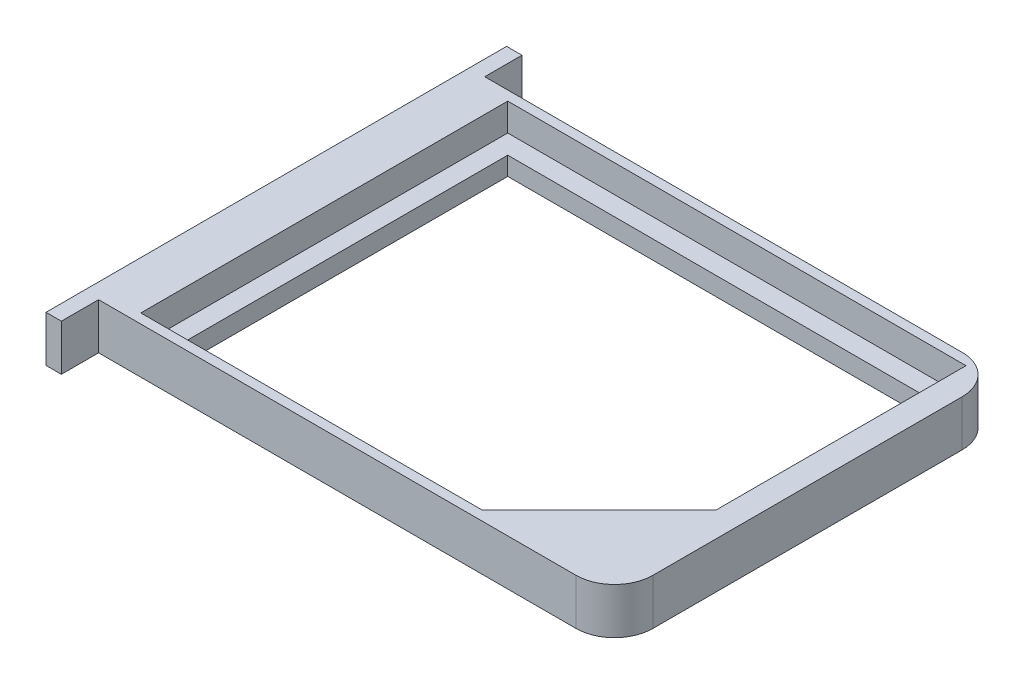
ISO-10303-21;
HEADER;
FILE_DESCRIPTION(('STEP AP214'),'2;1');
FILE_NAME('part.step','',(''),(''),'','','');
FILE_SCHEMA(('AUTOMOTIVE_DESIGN { 1 0 10303 214 1 1 1 1 }'));
ENDSEC;
DATA;
#1=APPLICATION_CONTEXT('core data for automotive mechanical design processes');
#2=APPLICATION_PROTOCOL_DEFINITION('international standard','automotive_design',2000,#1);
#3=PRODUCT_CONTEXT('',#1,'mechanical');
#4=PRODUCT('Part','Part','',(#3));
#5=PRODUCT_RELATED_PRODUCT_CATEGORY('part','',(#4));
#6=PRODUCT_DEFINITION_FORMATION('','',#4);
#7=PRODUCT_DEFINITION_CONTEXT('part definition',#1,'design');
#8=PRODUCT_DEFINITION('design','',#6,#7);
#9=PRODUCT_DEFINITION_SHAPE('','',#8);
#10=(LENGTH_UNIT() NAMED_UNIT(*) SI_UNIT(.MILLI.,.METRE.));
#11=(NAMED_UNIT(*) PLANE_ANGLE_UNIT() SI_UNIT($,.RADIAN.));
#12=(NAMED_UNIT(*) SI_UNIT($,.STERADIAN.) SOLID_ANGLE_UNIT());
#13=UNCERTAINTY_MEASURE_WITH_UNIT(LENGTH_MEASURE(1.E-05),#10,'distance_accuracy_value','');
#14=(GEOMETRIC_REPRESENTATION_CONTEXT(3) GLOBAL_UNCERTAINTY_ASSIGNED_CONTEXT((#13)) GLOBAL_UNIT_ASSIGNED_CONTEXT((#10,
#11,#12)) REPRESENTATION_CONTEXT('',''));
#15=CARTESIAN_POINT('',(0.,0.,0.));
#16=DIRECTION('',(0.,0.,1.));
#17=DIRECTION('',(1.,0.,0.));
#18=AXIS2_PLACEMENT_3D('',#15,#16,#17);
#19=CARTESIAN_POINT('',(16.2433,0.,-12.4587));
#20=DIRECTION('',(1.,0.,0.));
#21=DIRECTION('',(0.,0.,-1.));
#22=AXIS2_PLACEMENT_3D('',#19,#20,#21);
#23=PLANE('',#22);
#24=DIRECTION('',(0.,0.,-1.));
#25=VECTOR('',#24,1.);
#26=CARTESIAN_POINT('',(16.2433,0.6096,-4.19138494480313));
#27=LINE('',#26,#25);
#28=CARTESIAN_POINT('',(16.2433,0.6096,-4.19138494480313));
#29=VERTEX_POINT('',#28);
#30=CARTESIAN_POINT('',(16.2433,0.6096,-12.4587));
#31=VERTEX_POINT('',#30);
#32=EDGE_CURVE('E285',#29,#31,#27,.T.);
#33=ORIENTED_EDGE('',*,*,#32,.F.);
#34=DIRECTION('',(0.,-1.,0.));
#35=VECTOR('',#34,1.);
#36=CARTESIAN_POINT('',(16.2433,1.524,-4.19138494480313));
#37=LINE('',#36,#35);
#38=CARTESIAN_POINT('',(16.2433,1.524,-4.19138494480313));
#39=VERTEX_POINT('',#38);
#40=EDGE_CURVE('E293',#39,#29,#37,.T.);
#41=ORIENTED_EDGE('',*,*,#40,.F.);
#42=DIRECTION('',(0.,0.,-1.));
#43=VECTOR('',#42,1.);
#44=CARTESIAN_POINT('',(16.2433,1.524,-12.4587));
#45=LINE('',#44,#43);
#46=CARTESIAN_POINT('',(16.2433,1.524,-12.4587));
#47=VERTEX_POINT('',#46);
#48=EDGE_CURVE('E308',#39,#47,#45,.T.);
#49=ORIENTED_EDGE('',*,*,#48,.T.);
#50=DIRECTION('',(0.,1.,0.));
#51=VECTOR('',#50,1.);
#52=CARTESIAN_POINT('',(16.2433,0.,-12.4587));
#53=LINE('',#52,#51);
#54=EDGE_CURVE('E317',#31,#47,#53,.T.);
#55=ORIENTED_EDGE('',*,*,#54,.F.);
#56=EDGE_LOOP('',(#33,#41,#49,#55));
#57=FACE_BOUND('',#56,.T.);
#58=ADVANCED_FACE('F42',(#57),#23,.F.);
#59=CARTESIAN_POINT('',(1.07949999999999,0.,-12.4587));
#60=DIRECTION('',(-1.,0.,0.));
#61=DIRECTION('',(0.,0.,1.));
#62=AXIS2_PLACEMENT_3D('',#59,#60,#61);
#63=PLANE('',#62);
#64=DIRECTION('',(0.,0.,1.));
#65=VECTOR('',#64,1.);
#66=CARTESIAN_POINT('',(1.07949999999999,0.6096,-12.4587));
#67=LINE('',#66,#65);
#68=CARTESIAN_POINT('',(1.07949999999999,0.6096,-12.4587));
#69=VERTEX_POINT('',#68);
#70=CARTESIAN_POINT('',(1.0795,0.6096,-0.3175));
#71=VERTEX_POINT('',#70);
#72=EDGE_CURVE('E66',#69,#71,#67,.T.);
#73=ORIENTED_EDGE('',*,*,#72,.F.);
#74=DIRECTION('',(0.,1.,0.));
#75=VECTOR('',#74,1.);
#76=CARTESIAN_POINT('',(1.07949999999999,0.,-12.4587));
#77=LINE('',#76,#75);
#78=CARTESIAN_POINT('',(1.07949999999999,1.524,-12.4587));
#79=VERTEX_POINT('',#78);
#80=EDGE_CURVE('E312',#69,#79,#77,.T.);
#81=ORIENTED_EDGE('',*,*,#80,.T.);
#82=DIRECTION('',(0.,0.,1.));
#83=VECTOR('',#82,1.);
#84=CARTESIAN_POINT('',(1.07949999999999,1.524,-12.4587));
#85=LINE('',#84,#83);
#86=CARTESIAN_POINT('',(1.0795,1.524,-0.3175));
#87=VERTEX_POINT('',#86);
#88=EDGE_CURVE('E297',#79,#87,#85,.T.);
#89=ORIENTED_EDGE('',*,*,#88,.T.);
#90=DIRECTION('',(0.,1.,0.));
#91=VECTOR('',#90,1.);
#92=CARTESIAN_POINT('',(1.0795,0.,-0.3175));
#93=LINE('',#92,#91);
#94=EDGE_CURVE('E314',#71,#87,#93,.T.);
#95=ORIENTED_EDGE('',*,*,#94,.F.);
#96=EDGE_LOOP('',(#73,#81,#89,#95));
#97=FACE_BOUND('',#96,.T.);
#98=ADVANCED_FACE('F445',(#97),#63,.F.);
#99=CARTESIAN_POINT('',(1.07949999999999,0.,-12.4587));
#100=DIRECTION('',(0.,0.,-1.));
#101=DIRECTION('',(-1.,0.,0.));
#102=AXIS2_PLACEMENT_3D('',#99,#100,#101);
#103=PLANE('',#102);
#104=DIRECTION('',(-1.,0.,0.));
#105=VECTOR('',#104,1.);
#106=CARTESIAN_POINT('',(16.2433,0.6096,-12.4587));
#107=LINE('',#106,#105);
#108=EDGE_CURVE('E58',#31,#69,#107,.T.);
#109=ORIENTED_EDGE('',*,*,#108,.F.);
#110=ORIENTED_EDGE('',*,*,#54,.T.);
#111=DIRECTION('',(-1.,0.,0.));
#112=VECTOR('',#111,1.);
#113=CARTESIAN_POINT('',(1.07949999999999,1.524,-12.4587));
#114=LINE('',#113,#112);
#115=EDGE_CURVE('E309',#47,#79,#114,.T.);
#116=ORIENTED_EDGE('',*,*,#115,.T.);
#117=ORIENTED_EDGE('',*,*,#80,.F.);
#118=EDGE_LOOP('',(#109,#110,#116,#117));
#119=FACE_BOUND('',#118,.T.);
#120=ADVANCED_FACE('F447',(#119),#103,.F.);
#121=CARTESIAN_POINT('',(1.0795,0.,-0.3175));
#122=DIRECTION('',(0.,0.,1.));
#123=DIRECTION('',(1.,0.,0.));
#124=AXIS2_PLACEMENT_3D('',#121,#122,#123);
#125=PLANE('',#124);
#126=DIRECTION('',(1.,0.,0.));
#127=VECTOR('',#126,1.);
#128=CARTESIAN_POINT('',(1.0795,0.6096,-0.3175));
#129=LINE('',#128,#127);
#130=CARTESIAN_POINT('',(12.3694150551969,0.6096,-0.3175));
#131=VERTEX_POINT('',#130);
#132=EDGE_CURVE('E273',#71,#131,#129,.T.);
#133=ORIENTED_EDGE('',*,*,#132,.F.);
#134=ORIENTED_EDGE('',*,*,#94,.T.);
#135=DIRECTION('',(1.,0.,0.));
#136=VECTOR('',#135,1.);
#137=CARTESIAN_POINT('',(1.0795,1.524,-0.3175));
#138=LINE('',#137,#136);
#139=CARTESIAN_POINT('',(12.3694150551969,1.524,-0.3175));
#140=VERTEX_POINT('',#139);
#141=EDGE_CURVE('E305',#87,#140,#138,.T.);
#142=ORIENTED_EDGE('',*,*,#141,.T.);
#143=DIRECTION('',(0.,-1.,0.));
#144=VECTOR('',#143,1.);
#145=CARTESIAN_POINT('',(12.3694150551969,1.524,-0.3175));
#146=LINE('',#145,#144);
#147=EDGE_CURVE('E292',#140,#131,#146,.T.);
#148=ORIENTED_EDGE('',*,*,#147,.T.);
#149=EDGE_LOOP('',(#133,#134,#142,#148));
#150=FACE_BOUND('',#149,.T.);
#151=ADVANCED_FACE('F454',(#150),#125,.F.);
#152=CARTESIAN_POINT('',(12.3694150551969,1.524,-0.3175));
#153=DIRECTION('',(0.707106781186551,0.,0.707106781186543));
#154=DIRECTION('',(0.707106781186544,0.,-0.707106781186552));
#155=AXIS2_PLACEMENT_3D('',#152,#153,#154);
#156=PLANE('',#155);
#157=DIRECTION('',(0.707106781186544,0.,-0.707106781186551));
#158=VECTOR('',#157,1.);
#159=CARTESIAN_POINT('',(12.3694150551969,0.6096,-0.3175));
#160=LINE('',#159,#158);
#161=EDGE_CURVE('E279',#131,#29,#160,.T.);
#162=ORIENTED_EDGE('',*,*,#161,.F.);
#163=ORIENTED_EDGE('',*,*,#147,.F.);
#164=DIRECTION('',(-0.707106781186544,0.,0.707106781186551));
#165=VECTOR('',#164,1.);
#166=CARTESIAN_POINT('',(12.3694150551969,1.524,-0.3175));
#167=LINE('',#166,#165);
#168=EDGE_CURVE('E286',#39,#140,#167,.T.);
#169=ORIENTED_EDGE('',*,*,#168,.F.);
#170=ORIENTED_EDGE('',*,*,#40,.T.);
#171=EDGE_LOOP('',(#162,#163,#169,#170));
#172=FACE_BOUND('',#171,.T.);
#173=ADVANCED_FACE('F457',(#172),#156,.F.);
#174=CARTESIAN_POINT('',(0.,1.524,0.));
#175=DIRECTION('',(0.,0.,-1.));
#176=DIRECTION('',(-1.,0.,0.));
#177=AXIS2_PLACEMENT_3D('',#174,#175,#176);
#178=PLANE('',#177);
#179=DIRECTION('',(1.,0.,0.));
#180=VECTOR('',#179,1.);
#181=CARTESIAN_POINT('',(0.,0.,0.));
#182=LINE('',#181,#180);
#183=CARTESIAN_POINT('',(0.,0.,0.));
#184=VERTEX_POINT('',#183);
#185=CARTESIAN_POINT('',(15.7988,0.,0.));
#186=VERTEX_POINT('',#185);
#187=EDGE_CURVE('E318',#184,#186,#182,.T.);
#188=ORIENTED_EDGE('',*,*,#187,.T.);
#189=DIRECTION('',(0.,-1.,0.));
#190=VECTOR('',#189,1.);
#191=CARTESIAN_POINT('',(15.7988,1.524,0.));
#192=LINE('',#191,#190);
#193=CARTESIAN_POINT('',(15.7988,1.524,0.));
#194=VERTEX_POINT('',#193);
#195=EDGE_CURVE('E52',#194,#186,#192,.T.);
#196=ORIENTED_EDGE('',*,*,#195,.F.);
#197=DIRECTION('',(1.,0.,0.));
#198=VECTOR('',#197,1.);
#199=CARTESIAN_POINT('',(0.,1.524,0.));
#200=LINE('',#199,#198);
#201=CARTESIAN_POINT('',(0.,1.524,0.));
#202=VERTEX_POINT('',#201);
#203=EDGE_CURVE('E322',#202,#194,#200,.T.);
#204=ORIENTED_EDGE('',*,*,#203,.F.);
#205=DIRECTION('',(0.,-1.,0.));
#206=VECTOR('',#205,1.);
#207=CARTESIAN_POINT('',(0.,1.524,0.));
#208=LINE('',#207,#206);
#209=EDGE_CURVE('E11',#202,#184,#208,.T.);
#210=ORIENTED_EDGE('',*,*,#209,.T.);
#211=EDGE_LOOP('',(#188,#196,#204,#210));
#212=FACE_BOUND('',#211,.T.);
#213=ADVANCED_FACE('F46',(#212),#178,.F.);
#214=CARTESIAN_POINT('',(15.7988,1.524,-1.27));
#215=DIRECTION('',(0.,-1.,0.));
#216=DIRECTION('',(0.,0.,-1.));
#217=AXIS2_PLACEMENT_3D('',#214,#215,#216);
#218=CYLINDRICAL_SURFACE('',#217,1.27);
#219=CARTESIAN_POINT('',(15.7988,0.,-1.27));
#220=DIRECTION('',(0.,1.,0.));
#221=DIRECTION('',(0.,0.,1.));
#222=AXIS2_PLACEMENT_3D('',#219,#220,#221);
#223=CIRCLE('',#222,1.27);
#224=CARTESIAN_POINT('',(17.0688,0.,-1.27000000000001));
#225=VERTEX_POINT('',#224);
#226=EDGE_CURVE('E341',#186,#225,#223,.T.);
#227=ORIENTED_EDGE('',*,*,#226,.T.);
#228=DIRECTION('',(0.,-1.,0.));
#229=VECTOR('',#228,1.);
#230=CARTESIAN_POINT('',(17.0688,1.524,-1.27000000000001));
#231=LINE('',#230,#229);
#232=CARTESIAN_POINT('',(17.0688,1.524,-1.27000000000001));
#233=VERTEX_POINT('',#232);
#234=EDGE_CURVE('E364',#233,#225,#231,.T.);
#235=ORIENTED_EDGE('',*,*,#234,.F.);
#236=CARTESIAN_POINT('',(15.7988,1.524,-1.27));
#237=DIRECTION('',(0.,1.,0.));
#238=DIRECTION('',(0.,0.,1.));
#239=AXIS2_PLACEMENT_3D('',#236,#237,#238);
#240=CIRCLE('',#239,1.27);
#241=EDGE_CURVE('E330',#194,#233,#240,.T.);
#242=ORIENTED_EDGE('',*,*,#241,.F.);
#243=ORIENTED_EDGE('',*,*,#195,.T.);
#244=EDGE_LOOP('',(#227,#235,#242,#243));
#245=FACE_BOUND('',#244,.T.);
#246=ADVANCED_FACE('F372',(#245),#218,.T.);
#247=CARTESIAN_POINT('',(17.0688,1.524,-1.27000000000001));
#248=DIRECTION('',(-1.,0.,0.));
#249=DIRECTION('',(0.,0.,1.));
#250=AXIS2_PLACEMENT_3D('',#247,#248,#249);
#251=PLANE('',#250);
#252=DIRECTION('',(0.,0.,-1.));
#253=VECTOR('',#252,1.);
#254=CARTESIAN_POINT('',(17.0688,0.,-1.27000000000001));
#255=LINE('',#254,#253);
#256=CARTESIAN_POINT('',(17.0688,0.,-11.5062));
#257=VERTEX_POINT('',#256);
#258=EDGE_CURVE('E347',#225,#257,#255,.T.);
#259=ORIENTED_EDGE('',*,*,#258,.T.);
#260=DIRECTION('',(0.,-1.,0.));
#261=VECTOR('',#260,1.);
#262=CARTESIAN_POINT('',(17.0688,1.524,-11.5062));
#263=LINE('',#262,#261);
#264=CARTESIAN_POINT('',(17.0688,1.524,-11.5062));
#265=VERTEX_POINT('',#264);
#266=EDGE_CURVE('E363',#265,#257,#263,.T.);
#267=ORIENTED_EDGE('',*,*,#266,.F.);
#268=DIRECTION('',(0.,0.,-1.));
#269=VECTOR('',#268,1.);
#270=CARTESIAN_POINT('',(17.0688,1.524,-1.27000000000001));
#271=LINE('',#270,#269);
#272=EDGE_CURVE('E332',#233,#265,#271,.T.);
#273=ORIENTED_EDGE('',*,*,#272,.F.);
#274=ORIENTED_EDGE('',*,*,#234,.T.);
#275=EDGE_LOOP('',(#259,#267,#273,#274));
#276=FACE_BOUND('',#275,.T.);
#277=ADVANCED_FACE('F385',(#276),#251,.F.);
#278=CARTESIAN_POINT('',(15.7988,1.524,-11.5062));
#279=DIRECTION('',(0.,-1.,0.));
#280=DIRECTION('',(0.,0.,-1.));
#281=AXIS2_PLACEMENT_3D('',#278,#279,#280);
#282=CYLINDRICAL_SURFACE('',#281,1.27);
#283=CARTESIAN_POINT('',(15.7988,0.,-11.5062));
#284=DIRECTION('',(0.,1.,0.));
#285=DIRECTION('',(0.,0.,-1.));
#286=AXIS2_PLACEMENT_3D('',#283,#284,#285);
#287=CIRCLE('',#286,1.27);
#288=CARTESIAN_POINT('',(15.7988,0.,-12.7762));
#289=VERTEX_POINT('',#288);
#290=EDGE_CURVE('E349',#257,#289,#287,.T.);
#291=ORIENTED_EDGE('',*,*,#290,.T.);
#292=DIRECTION('',(0.,-1.,0.));
#293=VECTOR('',#292,1.);
#294=CARTESIAN_POINT('',(15.7988,1.524,-12.7762));
#295=LINE('',#294,#293);
#296=CARTESIAN_POINT('',(15.7988,1.524,-12.7762));
#297=VERTEX_POINT('',#296);
#298=EDGE_CURVE('E360',#297,#289,#295,.T.);
#299=ORIENTED_EDGE('',*,*,#298,.F.);
#300=CARTESIAN_POINT('',(15.7988,1.524,-11.5062));
#301=DIRECTION('',(0.,1.,0.));
#302=DIRECTION('',(0.,0.,-1.));
#303=AXIS2_PLACEMENT_3D('',#300,#301,#302);
#304=CIRCLE('',#303,1.27);
#305=EDGE_CURVE('E331',#265,#297,#304,.T.);
#306=ORIENTED_EDGE('',*,*,#305,.F.);
#307=ORIENTED_EDGE('',*,*,#266,.T.);
#308=EDGE_LOOP('',(#291,#299,#306,#307));
#309=FACE_BOUND('',#308,.T.);
#310=ADVANCED_FACE('F387',(#309),#282,.T.);
#311=CARTESIAN_POINT('',(0.,1.524,-12.7762));
#312=DIRECTION('',(0.,0.,1.));
#313=DIRECTION('',(1.,0.,0.));
#314=AXIS2_PLACEMENT_3D('',#311,#312,#313);
#315=PLANE('',#314);
#316=DIRECTION('',(-1.,0.,0.));
#317=VECTOR('',#316,1.);
#318=CARTESIAN_POINT('',(0.,0.,-12.7762));
#319=LINE('',#318,#317);
#320=CARTESIAN_POINT('',(0.,0.,-12.7762));
#321=VERTEX_POINT('',#320);
#322=EDGE_CURVE('E327',#289,#321,#319,.T.);
#323=ORIENTED_EDGE('',*,*,#322,.T.);
#324=DIRECTION('',(0.,-1.,0.));
#325=VECTOR('',#324,1.);
#326=CARTESIAN_POINT('',(0.,1.524,-12.7762));
#327=LINE('',#326,#325);
#328=CARTESIAN_POINT('',(0.,1.524,-12.7762));
#329=VERTEX_POINT('',#328);
#330=EDGE_CURVE('E339',#329,#321,#327,.T.);
#331=ORIENTED_EDGE('',*,*,#330,.F.);
#332=DIRECTION('',(-1.,0.,0.));
#333=VECTOR('',#332,1.);
#334=CARTESIAN_POINT('',(0.,1.524,-12.7762));
#335=LINE('',#334,#333);
#336=EDGE_CURVE('E340',#297,#329,#335,.T.);
#337=ORIENTED_EDGE('',*,*,#336,.F.);
#338=ORIENTED_EDGE('',*,*,#298,.T.);
#339=EDGE_LOOP('',(#323,#331,#337,#338));
#340=FACE_BOUND('',#339,.T.);
#341=ADVANCED_FACE('F427',(#340),#315,.F.);
#342=CARTESIAN_POINT('',(15.7988,1.524,-11.5062));
#343=DIRECTION('',(0.,-1.,0.));
#344=DIRECTION('',(0.,0.,-1.));
#345=AXIS2_PLACEMENT_3D('',#342,#343,#344);
#346=PLANE('',#345);
#347=ORIENTED_EDGE('',*,*,#141,.F.);
#348=ORIENTED_EDGE('',*,*,#88,.F.);
#349=ORIENTED_EDGE('',*,*,#115,.F.);
#350=ORIENTED_EDGE('',*,*,#48,.F.);
#351=ORIENTED_EDGE('',*,*,#168,.T.);
#352=EDGE_LOOP('',(#347,#348,#349,#350,#351));
#353=FACE_BOUND('',#352,.T.);
#354=ORIENTED_EDGE('',*,*,#336,.T.);
#355=DIRECTION('',(0.,0.,-1.));
#356=VECTOR('',#355,1.);
#357=CARTESIAN_POINT('',(0.,1.524,-14.0081));
#358=LINE('',#357,#356);
#359=CARTESIAN_POINT('',(0.,1.524,-14.0081));
#360=VERTEX_POINT('',#359);
#361=EDGE_CURVE('E415',#329,#360,#358,.T.);
#362=ORIENTED_EDGE('',*,*,#361,.T.);
#363=DIRECTION('',(1.,0.,0.));
#364=VECTOR('',#363,1.);
#365=CARTESIAN_POINT('',(-0.508000000000008,1.524,-14.0081));
#366=LINE('',#365,#364);
#367=CARTESIAN_POINT('',(-0.508000000000008,1.524,-14.0081));
#368=VERTEX_POINT('',#367);
#369=EDGE_CURVE('E412',#368,#360,#366,.T.);
#370=ORIENTED_EDGE('',*,*,#369,.F.);
#371=DIRECTION('',(0.,0.,-1.));
#372=VECTOR('',#371,1.);
#373=CARTESIAN_POINT('',(-0.508000000000008,1.524,-14.0081));
#374=LINE('',#373,#372);
#375=CARTESIAN_POINT('',(-0.507999999999999,1.524,1.2319));
#376=VERTEX_POINT('',#375);
#377=EDGE_CURVE('E205',#376,#368,#374,.T.);
#378=ORIENTED_EDGE('',*,*,#377,.F.);
#379=DIRECTION('',(1.,0.,0.));
#380=VECTOR('',#379,1.);
#381=CARTESIAN_POINT('',(-0.507999999999999,1.524,1.2319));
#382=LINE('',#381,#380);
#383=CARTESIAN_POINT('',(0.,1.524,1.2319));
#384=VERTEX_POINT('',#383);
#385=EDGE_CURVE('E219',#376,#384,#382,.T.);
#386=ORIENTED_EDGE('',*,*,#385,.T.);
#387=EDGE_CURVE('E210',#384,#202,#358,.T.);
#388=ORIENTED_EDGE('',*,*,#387,.T.);
#389=ORIENTED_EDGE('',*,*,#203,.T.);
#390=ORIENTED_EDGE('',*,*,#241,.T.);
#391=ORIENTED_EDGE('',*,*,#272,.T.);
#392=ORIENTED_EDGE('',*,*,#305,.T.);
#393=EDGE_LOOP('',(#354,#362,#370,#378,#386,#388,#389,#390,#391,#392));
#394=FACE_BOUND('',#393,.T.);
#395=ADVANCED_FACE('F388',(#353,#394),#346,.F.);
#396=CARTESIAN_POINT('',(15.7988,0.,-11.5062));
#397=DIRECTION('',(0.,-1.,0.));
#398=DIRECTION('',(0.,0.,-1.));
#399=AXIS2_PLACEMENT_3D('',#396,#397,#398);
#400=PLANE('',#399);
#401=ORIENTED_EDGE('',*,*,#187,.F.);
#402=DIRECTION('',(0.,0.,1.));
#403=VECTOR('',#402,1.);
#404=CARTESIAN_POINT('',(0.,0.,-14.0081));
#405=LINE('',#404,#403);
#406=CARTESIAN_POINT('',(0.,0.,1.2319));
#407=VERTEX_POINT('',#406);
#408=EDGE_CURVE('E397',#184,#407,#405,.T.);
#409=ORIENTED_EDGE('',*,*,#408,.T.);
#410=DIRECTION('',(1.,0.,0.));
#411=VECTOR('',#410,1.);
#412=CARTESIAN_POINT('',(-0.507999999999999,0.,1.2319));
#413=LINE('',#412,#411);
#414=CARTESIAN_POINT('',(-0.507999999999999,0.,1.2319));
#415=VERTEX_POINT('',#414);
#416=EDGE_CURVE('E195',#415,#407,#413,.T.);
#417=ORIENTED_EDGE('',*,*,#416,.F.);
#418=DIRECTION('',(0.,0.,1.));
#419=VECTOR('',#418,1.);
#420=CARTESIAN_POINT('',(-0.508000000000008,0.,-14.0081));
#421=LINE('',#420,#419);
#422=CARTESIAN_POINT('',(-0.508000000000008,0.,-14.0081));
#423=VERTEX_POINT('',#422);
#424=EDGE_CURVE('E181',#423,#415,#421,.T.);
#425=ORIENTED_EDGE('',*,*,#424,.F.);
#426=DIRECTION('',(1.,0.,0.));
#427=VECTOR('',#426,1.);
#428=CARTESIAN_POINT('',(-0.508000000000008,0.,-14.0081));
#429=LINE('',#428,#427);
#430=CARTESIAN_POINT('',(0.,0.,-14.0081));
#431=VERTEX_POINT('',#430);
#432=EDGE_CURVE('E188',#423,#431,#429,.T.);
#433=ORIENTED_EDGE('',*,*,#432,.T.);
#434=EDGE_CURVE('E401',#431,#321,#405,.T.);
#435=ORIENTED_EDGE('',*,*,#434,.T.);
#436=ORIENTED_EDGE('',*,*,#322,.F.);
#437=ORIENTED_EDGE('',*,*,#290,.F.);
#438=ORIENTED_EDGE('',*,*,#258,.F.);
#439=ORIENTED_EDGE('',*,*,#226,.F.);
#440=EDGE_LOOP('',(#401,#409,#417,#425,#433,#435,#436,#437,#438,#439));
#441=FACE_BOUND('',#440,.T.);
#442=DIRECTION('',(-1.,0.,0.));
#443=VECTOR('',#442,1.);
#444=CARTESIAN_POINT('',(15.6083,0.,-11.8237));
#445=LINE('',#444,#443);
#446=CARTESIAN_POINT('',(15.6083,0.,-11.8237));
#447=VERTEX_POINT('',#446);
#448=CARTESIAN_POINT('',(1.71449999999999,0.,-11.8237));
#449=VERTEX_POINT('',#448);
#450=EDGE_CURVE('E213',#447,#449,#445,.T.);
#451=ORIENTED_EDGE('',*,*,#450,.T.);
#452=DIRECTION('',(0.,0.,1.));
#453=VECTOR('',#452,1.);
#454=CARTESIAN_POINT('',(1.71449999999999,0.,-11.8237));
#455=LINE('',#454,#453);
#456=CARTESIAN_POINT('',(1.71449999999999,0.,-0.9525));
#457=VERTEX_POINT('',#456);
#458=EDGE_CURVE('E217',#449,#457,#455,.T.);
#459=ORIENTED_EDGE('',*,*,#458,.T.);
#460=DIRECTION('',(1.,0.,0.));
#461=VECTOR('',#460,1.);
#462=CARTESIAN_POINT('',(1.71449999999999,0.,-0.9525));
#463=LINE('',#462,#461);
#464=CARTESIAN_POINT('',(12.10638944309,0.,-0.9525));
#465=VERTEX_POINT('',#464);
#466=EDGE_CURVE('E244',#457,#465,#463,.T.);
#467=ORIENTED_EDGE('',*,*,#466,.T.);
#468=DIRECTION('',(0.707106781186543,0.,-0.707106781186551));
#469=VECTOR('',#468,1.);
#470=CARTESIAN_POINT('',(12.10638944309,0.,-0.9525));
#471=LINE('',#470,#469);
#472=CARTESIAN_POINT('',(15.6083,0.,-4.45441055691004));
#473=VERTEX_POINT('',#472);
#474=EDGE_CURVE('E249',#465,#473,#471,.T.);
#475=ORIENTED_EDGE('',*,*,#474,.T.);
#476=DIRECTION('',(0.,0.,-1.));
#477=VECTOR('',#476,1.);
#478=CARTESIAN_POINT('',(15.6083,0.,-4.45441055691004));
#479=LINE('',#478,#477);
#480=EDGE_CURVE('E227',#473,#447,#479,.T.);
#481=ORIENTED_EDGE('',*,*,#480,.T.);
#482=EDGE_LOOP('',(#451,#459,#467,#475,#481));
#483=FACE_BOUND('',#482,.T.);
#484=ADVANCED_FACE('F183',(#441,#483),#400,.T.);
#485=CARTESIAN_POINT('',(0.,0.6096,0.));
#486=DIRECTION('',(0.,1.,0.));
#487=DIRECTION('',(0.,0.,1.));
#488=AXIS2_PLACEMENT_3D('',#485,#486,#487);
#489=PLANE('',#488);
#490=ORIENTED_EDGE('',*,*,#72,.T.);
#491=ORIENTED_EDGE('',*,*,#132,.T.);
#492=ORIENTED_EDGE('',*,*,#161,.T.);
#493=ORIENTED_EDGE('',*,*,#32,.T.);
#494=ORIENTED_EDGE('',*,*,#108,.T.);
#495=EDGE_LOOP('',(#490,#491,#492,#493,#494));
#496=FACE_BOUND('',#495,.T.);
#497=DIRECTION('',(0.,0.,1.));
#498=VECTOR('',#497,1.);
#499=CARTESIAN_POINT('',(1.71449999999999,0.6096,-11.8237));
#500=LINE('',#499,#498);
#501=CARTESIAN_POINT('',(1.71449999999999,0.6096,-11.8237));
#502=VERTEX_POINT('',#501);
#503=CARTESIAN_POINT('',(1.71449999999999,0.6096,-0.9525));
#504=VERTEX_POINT('',#503);
#505=EDGE_CURVE('E230',#502,#504,#500,.T.);
#506=ORIENTED_EDGE('',*,*,#505,.F.);
#507=DIRECTION('',(-1.,0.,0.));
#508=VECTOR('',#507,1.);
#509=CARTESIAN_POINT('',(15.6083,0.6096,-11.8237));
#510=LINE('',#509,#508);
#511=CARTESIAN_POINT('',(15.6083,0.6096,-11.8237));
#512=VERTEX_POINT('',#511);
#513=EDGE_CURVE('E221',#512,#502,#510,.T.);
#514=ORIENTED_EDGE('',*,*,#513,.F.);
#515=DIRECTION('',(0.,0.,-1.));
#516=VECTOR('',#515,1.);
#517=CARTESIAN_POINT('',(15.6083,0.6096,-4.45441055691004));
#518=LINE('',#517,#516);
#519=CARTESIAN_POINT('',(15.6083,0.6096,-4.45441055691004));
#520=VERTEX_POINT('',#519);
#521=EDGE_CURVE('E236',#520,#512,#518,.T.);
#522=ORIENTED_EDGE('',*,*,#521,.F.);
#523=DIRECTION('',(0.707106781186543,0.,-0.707106781186551));
#524=VECTOR('',#523,1.);
#525=CARTESIAN_POINT('',(12.10638944309,0.6096,-0.9525));
#526=LINE('',#525,#524);
#527=CARTESIAN_POINT('',(12.10638944309,0.6096,-0.9525));
#528=VERTEX_POINT('',#527);
#529=EDGE_CURVE('E234',#528,#520,#526,.T.);
#530=ORIENTED_EDGE('',*,*,#529,.F.);
#531=DIRECTION('',(1.,0.,0.));
#532=VECTOR('',#531,1.);
#533=CARTESIAN_POINT('',(1.71449999999999,0.6096,-0.9525));
#534=LINE('',#533,#532);
#535=EDGE_CURVE('E233',#504,#528,#534,.T.);
#536=ORIENTED_EDGE('',*,*,#535,.F.);
#537=EDGE_LOOP('',(#506,#514,#522,#530,#536));
#538=FACE_BOUND('',#537,.T.);
#539=ADVANCED_FACE('F459',(#496,#538),#489,.T.);
#540=CARTESIAN_POINT('',(15.6083,0.6096,-11.8237));
#541=DIRECTION('',(0.,0.,1.));
#542=DIRECTION('',(1.,0.,0.));
#543=AXIS2_PLACEMENT_3D('',#540,#541,#542);
#544=PLANE('',#543);
#545=ORIENTED_EDGE('',*,*,#450,.F.);
#546=DIRECTION('',(0.,-1.,0.));
#547=VECTOR('',#546,1.);
#548=CARTESIAN_POINT('',(15.6083,0.6096,-11.8237));
#549=LINE('',#548,#547);
#550=EDGE_CURVE('E238',#512,#447,#549,.T.);
#551=ORIENTED_EDGE('',*,*,#550,.F.);
#552=ORIENTED_EDGE('',*,*,#513,.T.);
#553=DIRECTION('',(0.,-1.,0.));
#554=VECTOR('',#553,1.);
#555=CARTESIAN_POINT('',(1.71449999999999,0.6096,-11.8237));
#556=LINE('',#555,#554);
#557=EDGE_CURVE('E268',#502,#449,#556,.T.);
#558=ORIENTED_EDGE('',*,*,#557,.T.);
#559=EDGE_LOOP('',(#545,#551,#552,#558));
#560=FACE_BOUND('',#559,.T.);
#561=ADVANCED_FACE('F463',(#560),#544,.T.);
#562=CARTESIAN_POINT('',(1.71449999999999,0.6096,-11.8237));
#563=DIRECTION('',(1.,0.,0.));
#564=DIRECTION('',(0.,0.,-1.));
#565=AXIS2_PLACEMENT_3D('',#562,#563,#564);
#566=PLANE('',#565);
#567=ORIENTED_EDGE('',*,*,#458,.F.);
#568=ORIENTED_EDGE('',*,*,#557,.F.);
#569=ORIENTED_EDGE('',*,*,#505,.T.);
#570=DIRECTION('',(0.,-1.,0.));
#571=VECTOR('',#570,1.);
#572=CARTESIAN_POINT('',(1.71449999999999,0.6096,-0.9525));
#573=LINE('',#572,#571);
#574=EDGE_CURVE('E264',#504,#457,#573,.T.);
#575=ORIENTED_EDGE('',*,*,#574,.T.);
#576=EDGE_LOOP('',(#567,#568,#569,#575));
#577=FACE_BOUND('',#576,.T.);
#578=ADVANCED_FACE('F473',(#577),#566,.T.);
#579=CARTESIAN_POINT('',(1.71449999999999,0.6096,-0.9525));
#580=DIRECTION('',(0.,0.,-1.));
#581=DIRECTION('',(-1.,0.,0.));
#582=AXIS2_PLACEMENT_3D('',#579,#580,#581);
#583=PLANE('',#582);
#584=ORIENTED_EDGE('',*,*,#466,.F.);
#585=ORIENTED_EDGE('',*,*,#574,.F.);
#586=ORIENTED_EDGE('',*,*,#535,.T.);
#587=DIRECTION('',(0.,-1.,0.));
#588=VECTOR('',#587,1.);
#589=CARTESIAN_POINT('',(12.10638944309,0.6096,-0.9525));
#590=LINE('',#589,#588);
#591=EDGE_CURVE('E265',#528,#465,#590,.T.);
#592=ORIENTED_EDGE('',*,*,#591,.T.);
#593=EDGE_LOOP('',(#584,#585,#586,#592));
#594=FACE_BOUND('',#593,.T.);
#595=ADVANCED_FACE('F560',(#594),#583,.T.);
#596=CARTESIAN_POINT('',(12.10638944309,0.6096,-0.9525));
#597=DIRECTION('',(-0.707106781186551,0.,-0.707106781186543));
#598=DIRECTION('',(-0.707106781186544,0.,0.707106781186552));
#599=AXIS2_PLACEMENT_3D('',#596,#597,#598);
#600=PLANE('',#599);
#601=ORIENTED_EDGE('',*,*,#474,.F.);
#602=ORIENTED_EDGE('',*,*,#591,.F.);
#603=ORIENTED_EDGE('',*,*,#529,.T.);
#604=DIRECTION('',(0.,-1.,0.));
#605=VECTOR('',#604,1.);
#606=CARTESIAN_POINT('',(15.6083,0.6096,-4.45441055691004));
#607=LINE('',#606,#605);
#608=EDGE_CURVE('E259',#520,#473,#607,.T.);
#609=ORIENTED_EDGE('',*,*,#608,.T.);
#610=EDGE_LOOP('',(#601,#602,#603,#609));
#611=FACE_BOUND('',#610,.T.);
#612=ADVANCED_FACE('F550',(#611),#600,.T.);
#613=CARTESIAN_POINT('',(15.6083,0.6096,-4.45441055691004));
#614=DIRECTION('',(-1.,0.,0.));
#615=DIRECTION('',(0.,0.,1.));
#616=AXIS2_PLACEMENT_3D('',#613,#614,#615);
#617=PLANE('',#616);
#618=ORIENTED_EDGE('',*,*,#480,.F.);
#619=ORIENTED_EDGE('',*,*,#608,.F.);
#620=ORIENTED_EDGE('',*,*,#521,.T.);
#621=ORIENTED_EDGE('',*,*,#550,.T.);
#622=EDGE_LOOP('',(#618,#619,#620,#621));
#623=FACE_BOUND('',#622,.T.);
#624=ADVANCED_FACE('F543',(#623),#617,.T.);
#625=CARTESIAN_POINT('',(0.,0.,0.));
#626=DIRECTION('',(-1.,0.,0.));
#627=DIRECTION('',(0.,0.,1.));
#628=AXIS2_PLACEMENT_3D('',#625,#626,#627);
#629=PLANE('',#628);
#630=ORIENTED_EDGE('',*,*,#361,.F.);
#631=ORIENTED_EDGE('',*,*,#330,.T.);
#632=ORIENTED_EDGE('',*,*,#434,.F.);
#633=DIRECTION('',(0.,-1.,0.));
#634=VECTOR('',#633,1.);
#635=CARTESIAN_POINT('',(0.,1.524,-14.0081));
#636=LINE('',#635,#634);
#637=EDGE_CURVE('E211',#360,#431,#636,.T.);
#638=ORIENTED_EDGE('',*,*,#637,.F.);
#639=EDGE_LOOP('',(#630,#631,#632,#638));
#640=FACE_BOUND('',#639,.T.);
#641=ADVANCED_FACE('F430',(#640),#629,.F.);
#642=CARTESIAN_POINT('',(-0.508000000000008,1.524,-14.0081));
#643=DIRECTION('',(0.,0.,1.));
#644=DIRECTION('',(1.,0.,0.));
#645=AXIS2_PLACEMENT_3D('',#642,#643,#644);
#646=PLANE('',#645);
#647=ORIENTED_EDGE('',*,*,#637,.T.);
#648=ORIENTED_EDGE('',*,*,#432,.F.);
#649=DIRECTION('',(0.,-1.,0.));
#650=VECTOR('',#649,1.);
#651=CARTESIAN_POINT('',(-0.508000000000008,1.524,-14.0081));
#652=LINE('',#651,#650);
#653=EDGE_CURVE('E197',#368,#423,#652,.T.);
#654=ORIENTED_EDGE('',*,*,#653,.F.);
#655=ORIENTED_EDGE('',*,*,#369,.T.);
#656=EDGE_LOOP('',(#647,#648,#654,#655));
#657=FACE_BOUND('',#656,.T.);
#658=ADVANCED_FACE('F207',(#657),#646,.F.);
#659=CARTESIAN_POINT('',(-0.507999999999999,1.524,1.2319));
#660=DIRECTION('',(0.,0.,-1.));
#661=DIRECTION('',(-1.,0.,0.));
#662=AXIS2_PLACEMENT_3D('',#659,#660,#661);
#663=PLANE('',#662);
#664=DIRECTION('',(0.,1.,0.));
#665=VECTOR('',#664,1.);
#666=CARTESIAN_POINT('',(0.,1.524,1.2319));
#667=LINE('',#666,#665);
#668=EDGE_CURVE('E402',#407,#384,#667,.T.);
#669=ORIENTED_EDGE('',*,*,#668,.T.);
#670=ORIENTED_EDGE('',*,*,#385,.F.);
#671=DIRECTION('',(0.,1.,0.));
#672=VECTOR('',#671,1.);
#673=CARTESIAN_POINT('',(-0.507999999999999,1.524,1.2319));
#674=LINE('',#673,#672);
#675=EDGE_CURVE('E198',#415,#376,#674,.T.);
#676=ORIENTED_EDGE('',*,*,#675,.F.);
#677=ORIENTED_EDGE('',*,*,#416,.T.);
#678=EDGE_LOOP('',(#669,#670,#676,#677));
#679=FACE_BOUND('',#678,.T.);
#680=ADVANCED_FACE('F419',(#679),#663,.F.);
#681=CARTESIAN_POINT('',(-0.508,0.,0.));
#682=DIRECTION('',(-1.,0.,0.));
#683=DIRECTION('',(0.,0.,1.));
#684=AXIS2_PLACEMENT_3D('',#681,#682,#683);
#685=PLANE('',#684);
#686=ORIENTED_EDGE('',*,*,#653,.T.);
#687=ORIENTED_EDGE('',*,*,#424,.T.);
#688=ORIENTED_EDGE('',*,*,#675,.T.);
#689=ORIENTED_EDGE('',*,*,#377,.T.);
#690=EDGE_LOOP('',(#686,#687,#688,#689));
#691=FACE_BOUND('',#690,.T.);
#692=ADVANCED_FACE('F199',(#691),#685,.T.);
#693=ORIENTED_EDGE('',*,*,#209,.F.);
#694=ORIENTED_EDGE('',*,*,#387,.F.);
#695=ORIENTED_EDGE('',*,*,#668,.F.);
#696=ORIENTED_EDGE('',*,*,#408,.F.);
#697=EDGE_LOOP('',(#693,#694,#695,#696));
#698=FACE_BOUND('',#697,.T.);
#699=ADVANCED_FACE('F396',(#698),#629,.F.);
#700=CLOSED_SHELL('',(#58,#98,#120,#151,#173,#213,#246,#277,#310,#341,#395,#484,#539,#561,#578,
#595,#612,#624,#641,#658,#680,#692,#699));
#701=MANIFOLD_SOLID_BREP('B2',#700);
#702=ADVANCED_BREP_SHAPE_REPRESENTATION('',(#18,#701),#14);
#703=SHAPE_DEFINITION_REPRESENTATION(#9,#702);
ENDSEC;
END-ISO-10303-21;
